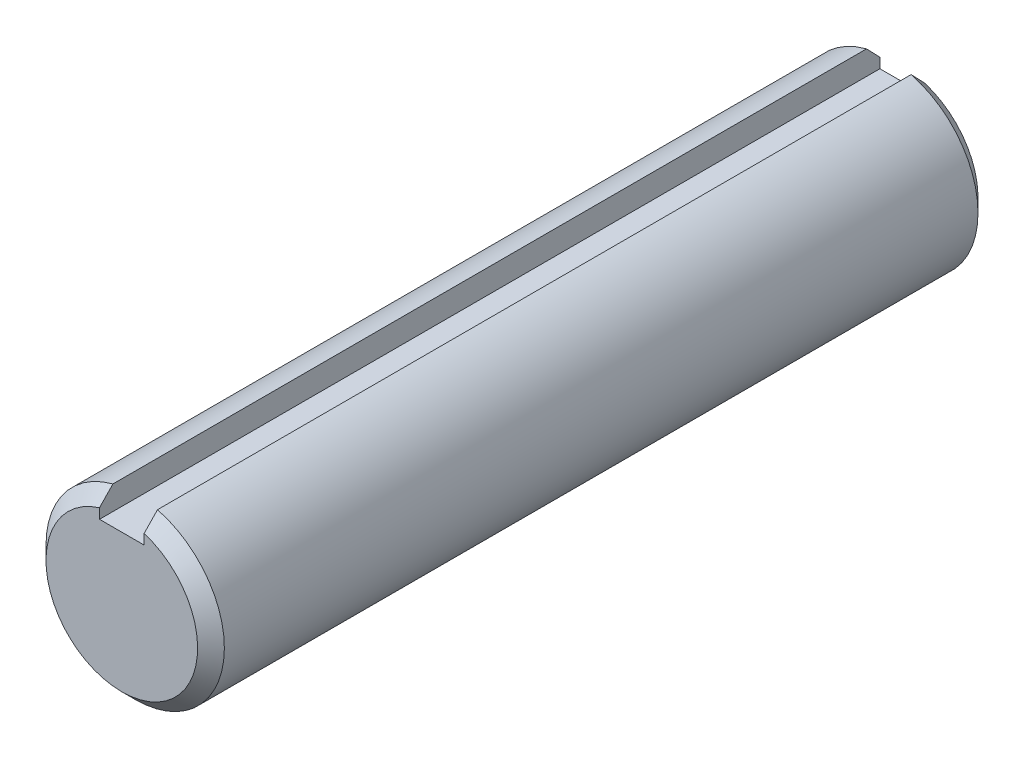
ISO-10303-21;
HEADER;
FILE_DESCRIPTION(('STEP AP214'),'2;1');
FILE_NAME('part.step','',(''),(''),'','','');
FILE_SCHEMA(('AUTOMOTIVE_DESIGN { 1 0 10303 214 1 1 1 1 }'));
ENDSEC;
DATA;
#1=APPLICATION_CONTEXT('core data for automotive mechanical design processes');
#2=APPLICATION_PROTOCOL_DEFINITION('international standard','automotive_design',2000,#1);
#3=PRODUCT_CONTEXT('',#1,'mechanical');
#4=PRODUCT('Part','Part','',(#3));
#5=PRODUCT_RELATED_PRODUCT_CATEGORY('part','',(#4));
#6=PRODUCT_DEFINITION_FORMATION('','',#4);
#7=PRODUCT_DEFINITION_CONTEXT('part definition',#1,'design');
#8=PRODUCT_DEFINITION('design','',#6,#7);
#9=PRODUCT_DEFINITION_SHAPE('','',#8);
#10=(LENGTH_UNIT() NAMED_UNIT(*) SI_UNIT(.MILLI.,.METRE.));
#11=(NAMED_UNIT(*) PLANE_ANGLE_UNIT() SI_UNIT($,.RADIAN.));
#12=(NAMED_UNIT(*) SI_UNIT($,.STERADIAN.) SOLID_ANGLE_UNIT());
#13=UNCERTAINTY_MEASURE_WITH_UNIT(LENGTH_MEASURE(1.E-05),#10,'distance_accuracy_value','');
#14=(GEOMETRIC_REPRESENTATION_CONTEXT(3) GLOBAL_UNCERTAINTY_ASSIGNED_CONTEXT((#13)) GLOBAL_UNIT_ASSIGNED_CONTEXT((#10,
#11,#12)) REPRESENTATION_CONTEXT('',''));
#15=CARTESIAN_POINT('',(0.,0.,0.));
#16=DIRECTION('',(0.,0.,1.));
#17=DIRECTION('',(1.,0.,0.));
#18=AXIS2_PLACEMENT_3D('',#15,#16,#17);
#19=CARTESIAN_POINT('',(0.,0.,17.5));
#20=DIRECTION('',(0.,0.,-1.));
#21=DIRECTION('',(-1.,0.,0.));
#22=AXIS2_PLACEMENT_3D('',#19,#20,#21);
#23=CYLINDRICAL_SURFACE('',#22,4.);
#24=CARTESIAN_POINT('',(0.,0.,16.9));
#25=DIRECTION('',(0.,0.,1.));
#26=DIRECTION('',(1.,0.,0.));
#27=AXIS2_PLACEMENT_3D('',#24,#25,#26);
#28=CIRCLE('',#27,4.);
#29=CARTESIAN_POINT('',(1.,3.87298334620742,16.9));
#30=VERTEX_POINT('',#29);
#31=CARTESIAN_POINT('',(-1.,3.87298334620742,16.9));
#32=VERTEX_POINT('',#31);
#33=EDGE_CURVE('E152',#30,#32,#28,.F.);
#34=ORIENTED_EDGE('',*,*,#33,.T.);
#35=DIRECTION('',(0.,0.,-1.));
#36=VECTOR('',#35,1.);
#37=CARTESIAN_POINT('',(-1.,3.87298334620742,17.5));
#38=LINE('',#37,#36);
#39=CARTESIAN_POINT('',(-1.,3.87298334620742,-16.9));
#40=VERTEX_POINT('',#39);
#41=EDGE_CURVE('E129',#32,#40,#38,.T.);
#42=ORIENTED_EDGE('',*,*,#41,.T.);
#43=CARTESIAN_POINT('',(0.,0.,-16.9));
#44=DIRECTION('',(0.,0.,1.));
#45=DIRECTION('',(1.,0.,0.));
#46=AXIS2_PLACEMENT_3D('',#43,#44,#45);
#47=CIRCLE('',#46,4.);
#48=CARTESIAN_POINT('',(1.,3.87298334620742,-16.9));
#49=VERTEX_POINT('',#48);
#50=EDGE_CURVE('E149',#40,#49,#47,.T.);
#51=ORIENTED_EDGE('',*,*,#50,.T.);
#52=DIRECTION('',(0.,0.,-1.));
#53=VECTOR('',#52,1.);
#54=CARTESIAN_POINT('',(1.,3.87298334620742,17.5));
#55=LINE('',#54,#53);
#56=EDGE_CURVE('E118',#49,#30,#55,.F.);
#57=ORIENTED_EDGE('',*,*,#56,.T.);
#58=EDGE_LOOP('',(#34,#42,#51,#57));
#59=FACE_BOUND('',#58,.T.);
#60=ADVANCED_FACE('F32',(#59),#23,.T.);
#61=CARTESIAN_POINT('',(0.,0.,17.5));
#62=DIRECTION('',(0.,0.,1.));
#63=DIRECTION('',(1.,0.,0.));
#64=AXIS2_PLACEMENT_3D('',#61,#62,#63);
#65=PLANE('',#64);
#66=DIRECTION('',(0.,-1.,0.));
#67=VECTOR('',#66,1.);
#68=CARTESIAN_POINT('',(-1.,4.,17.5));
#69=LINE('',#68,#67);
#70=CARTESIAN_POINT('',(-1.,3.24961536185438,17.5));
#71=VERTEX_POINT('',#70);
#72=CARTESIAN_POINT('',(-1.,2.8,17.5));
#73=VERTEX_POINT('',#72);
#74=EDGE_CURVE('E88',#71,#73,#69,.T.);
#75=ORIENTED_EDGE('',*,*,#74,.F.);
#76=CARTESIAN_POINT('',(0.,0.,17.5));
#77=DIRECTION('',(0.,0.,1.));
#78=DIRECTION('',(1.,0.,0.));
#79=AXIS2_PLACEMENT_3D('',#76,#77,#78);
#80=CIRCLE('',#79,3.4);
#81=CARTESIAN_POINT('',(1.,3.24961536185438,17.5));
#82=VERTEX_POINT('',#81);
#83=EDGE_CURVE('E144',#71,#82,#80,.T.);
#84=ORIENTED_EDGE('',*,*,#83,.T.);
#85=DIRECTION('',(0.,1.,0.));
#86=VECTOR('',#85,1.);
#87=CARTESIAN_POINT('',(1.,4.,17.5));
#88=LINE('',#87,#86);
#89=CARTESIAN_POINT('',(1.,2.8,17.5));
#90=VERTEX_POINT('',#89);
#91=EDGE_CURVE('E53',#90,#82,#88,.T.);
#92=ORIENTED_EDGE('',*,*,#91,.F.);
#93=DIRECTION('',(1.,0.,0.));
#94=VECTOR('',#93,1.);
#95=CARTESIAN_POINT('',(-1.,2.8,17.5));
#96=LINE('',#95,#94);
#97=EDGE_CURVE('E98',#73,#90,#96,.T.);
#98=ORIENTED_EDGE('',*,*,#97,.F.);
#99=EDGE_LOOP('',(#75,#84,#92,#98));
#100=FACE_BOUND('',#99,.T.);
#101=ADVANCED_FACE('F109',(#100),#65,.T.);
#102=CARTESIAN_POINT('',(0.,0.,-17.5));
#103=DIRECTION('',(0.,0.,1.));
#104=DIRECTION('',(1.,0.,0.));
#105=AXIS2_PLACEMENT_3D('',#102,#103,#104);
#106=PLANE('',#105);
#107=CARTESIAN_POINT('',(0.,0.,-17.5));
#108=DIRECTION('',(0.,0.,1.));
#109=DIRECTION('',(1.,0.,0.));
#110=AXIS2_PLACEMENT_3D('',#107,#108,#109);
#111=CIRCLE('',#110,3.39999999999999);
#112=CARTESIAN_POINT('',(1.,3.24961536185437,-17.5));
#113=VERTEX_POINT('',#112);
#114=CARTESIAN_POINT('',(-1.,3.24961536185437,-17.5));
#115=VERTEX_POINT('',#114);
#116=EDGE_CURVE('E146',#113,#115,#111,.F.);
#117=ORIENTED_EDGE('',*,*,#116,.T.);
#118=DIRECTION('',(0.,-1.,0.));
#119=VECTOR('',#118,1.);
#120=CARTESIAN_POINT('',(-1.,4.,-17.5));
#121=LINE('',#120,#119);
#122=CARTESIAN_POINT('',(-1.,2.8,-17.5));
#123=VERTEX_POINT('',#122);
#124=EDGE_CURVE('E111',#115,#123,#121,.T.);
#125=ORIENTED_EDGE('',*,*,#124,.T.);
#126=DIRECTION('',(1.,0.,0.));
#127=VECTOR('',#126,1.);
#128=CARTESIAN_POINT('',(-1.,2.8,-17.5));
#129=LINE('',#128,#127);
#130=CARTESIAN_POINT('',(1.,2.8,-17.5));
#131=VERTEX_POINT('',#130);
#132=EDGE_CURVE('E104',#123,#131,#129,.T.);
#133=ORIENTED_EDGE('',*,*,#132,.T.);
#134=DIRECTION('',(0.,1.,0.));
#135=VECTOR('',#134,1.);
#136=CARTESIAN_POINT('',(1.,4.,-17.5));
#137=LINE('',#136,#135);
#138=EDGE_CURVE('E107',#131,#113,#137,.T.);
#139=ORIENTED_EDGE('',*,*,#138,.T.);
#140=EDGE_LOOP('',(#117,#125,#133,#139));
#141=FACE_BOUND('',#140,.T.);
#142=ADVANCED_FACE('F164',(#141),#106,.F.);
#143=CARTESIAN_POINT('',(0.,0.,-16.9));
#144=DIRECTION('',(0.,0.,1.));
#145=DIRECTION('',(1.,0.,0.));
#146=AXIS2_PLACEMENT_3D('',#143,#144,#145);
#147=CONICAL_SURFACE('',#146,4.,0.785398163397448);
#148=CARTESIAN_POINT('',(-1.,1.35081586044512,-19.2193145776707));
#149=CARTESIAN_POINT('',(-1.,1.41488066306063,-19.1677819180893));
#150=CARTESIAN_POINT('',(-1.,1.47834718315388,-19.1155190121442));
#151=CARTESIAN_POINT('',(-1.,1.60431909726052,-19.0098610895691));
#152=CARTESIAN_POINT('',(-1.,1.66682460819919,-18.9564662125761));
#153=CARTESIAN_POINT('',(-1.,1.79110830645551,-18.8488748489054));
#154=CARTESIAN_POINT('',(-1.,1.85288669062793,-18.7946785885892));
#155=CARTESIAN_POINT('',(-1.,1.97588779267709,-18.6856554471097));
#156=CARTESIAN_POINT('',(-1.,2.03711049082799,-18.6308285437153));
#157=CARTESIAN_POINT('',(-1.,2.22007183752193,-18.4656732576281));
#158=CARTESIAN_POINT('',(-1.,2.34115805740112,-18.3546228023411));
#159=CARTESIAN_POINT('',(-1.,2.58220273418877,-18.1312938836685));
#160=CARTESIAN_POINT('',(-1.,2.70216111581648,-18.0190153393776));
#161=CARTESIAN_POINT('',(-1.,2.90589091931234,-17.8269857063987));
#162=CARTESIAN_POINT('',(-1.,2.98986154396475,-17.7474457040524));
#163=CARTESIAN_POINT('',(-1.,3.15749767385886,-17.5880337926722));
#164=CARTESIAN_POINT('',(-1.,3.24116315833901,-17.5081618618169));
#165=CARTESIAN_POINT('',(-1.,3.48509842555487,-17.2745671002813));
#166=CARTESIAN_POINT('',(-1.,3.64503682524598,-17.1204983050087));
#167=CARTESIAN_POINT('',(-1.,3.96429640051124,-16.811722329736));
#168=CARTESIAN_POINT('',(-1.,4.1236175738643,-16.6570151474428));
#169=CARTESIAN_POINT('',(-1.,4.44177985420495,-16.3471885210976));
#170=CARTESIAN_POINT('',(-1.,4.60062107239222,-16.1920691911779));
#171=CARTESIAN_POINT('',(-1.,4.91797030091099,-15.8814935510322));
#172=CARTESIAN_POINT('',(-1.,5.07647831497418,-15.7260372446202));
#173=CARTESIAN_POINT('',(-1.,5.23487471717617,-15.5704678156023));
#174=B_SPLINE_CURVE_WITH_KNOTS('',3,(#148,#149,#150,#151,#152,#153,#154,#155,#156,#157,#158,
#159,#160,#161,#162,#163,#164,#165,#166,#167,#168,#169,#170,#171,#172,#173),.UNSPECIFIED.,.F.,
.F.,(4,2,2,2,2,2,2,2,2,2,2,2,4),(0.,0.246638527108011,0.493246804550317,0.73978670666486,
0.98633532653122,1.47921612753496,1.97212959697097,2.31911430749398,2.66612220192963,
3.332345371537,3.99857093633251,4.6646280446703,5.33067765339345),.UNSPECIFIED.);
#175=EDGE_CURVE('E61',#115,#40,#174,.T.);
#176=ORIENTED_EDGE('',*,*,#175,.F.);
#177=ORIENTED_EDGE('',*,*,#116,.F.);
#178=CARTESIAN_POINT('',(1.,5.23487471717617,-15.5704678156023));
#179=CARTESIAN_POINT('',(1.,5.07642976511734,-15.7260850635911));
#180=CARTESIAN_POINT('',(1.,4.91787303822036,-15.8815890063281));
#181=CARTESIAN_POINT('',(1.,4.60043442524243,-16.1922515783813));
#182=CARTESIAN_POINT('',(1.,4.44155255272162,-16.3474102215566));
#183=CARTESIAN_POINT('',(1.,4.12339792056105,-16.6572286939957));
#184=CARTESIAN_POINT('',(1.,3.96412529582628,-16.8118886617124));
#185=CARTESIAN_POINT('',(1.,3.64495454195615,-17.1205770374935));
#186=CARTESIAN_POINT('',(1.,3.48505638500136,-17.2746054168307));
#187=CARTESIAN_POINT('',(1.,3.16427810361861,-17.5817896736052));
#188=CARTESIAN_POINT('',(1.,3.00339754942277,-17.7349451025749));
#189=CARTESIAN_POINT('',(1.,2.68026393133356,-18.0397741705045));
#190=CARTESIAN_POINT('',(1.,2.51801101305171,-18.1914479630795));
#191=CARTESIAN_POINT('',(1.,2.27284509960379,-18.4170936253633));
#192=CARTESIAN_POINT('',(1.,2.19080682391783,-18.4920145563211));
#193=CARTESIAN_POINT('',(1.,2.02594222380101,-18.6409764949062));
#194=CARTESIAN_POINT('',(1.,1.94311594332784,-18.7150175511038));
#195=CARTESIAN_POINT('',(1.,1.77634824406914,-18.8619013656389));
#196=CARTESIAN_POINT('',(1.,1.69240642828068,-18.9347436755316));
#197=CARTESIAN_POINT('',(1.,1.56532637426185,-19.0426501770363));
#198=CARTESIAN_POINT('',(1.,1.52276776255762,-19.0783961330172));
#199=CARTESIAN_POINT('',(1.,1.43717223649483,-19.1493154130559));
#200=CARTESIAN_POINT('',(1.,1.39413529386853,-19.1844887029652));
#201=CARTESIAN_POINT('',(1.,1.35081586044512,-19.2193145776707));
#202=B_SPLINE_CURVE_WITH_KNOTS('',3,(#178,#179,#180,#181,#182,#183,#184,#185,#186,#187,#188,
#189,#190,#191,#192,#193,#194,#195,#196,#197,#198,#199,#200,#201),.UNSPECIFIED.,.F.,.F.,(4,2,2,
2,2,2,2,2,2,2,2,4),(0.,0.66625401987663,1.33248079806412,1.9985031425817,2.66455545185874,
3.33092366291565,3.99722203595525,4.33052034592894,4.66380017110566,4.99720196323079,
5.16393407836719,5.3306760997552),.UNSPECIFIED.);
#203=EDGE_CURVE('E122',#49,#113,#202,.T.);
#204=ORIENTED_EDGE('',*,*,#203,.F.);
#205=ORIENTED_EDGE('',*,*,#50,.F.);
#206=EDGE_LOOP('',(#176,#177,#204,#205));
#207=FACE_BOUND('',#206,.T.);
#208=ADVANCED_FACE('F131',(#207),#147,.T.);
#209=CARTESIAN_POINT('',(0.,0.,17.5));
#210=DIRECTION('',(0.,0.,-1.));
#211=DIRECTION('',(-1.,0.,0.));
#212=AXIS2_PLACEMENT_3D('',#209,#210,#211);
#213=CONICAL_SURFACE('',#212,3.4,0.785398163397448);
#214=CARTESIAN_POINT('',(-1.,5.23487471717617,15.5704678156024));
#215=CARTESIAN_POINT('',(-1.,5.07642976511733,15.7260850635911));
#216=CARTESIAN_POINT('',(-1.,4.91787303822035,15.8815890063281));
#217=CARTESIAN_POINT('',(-1.,4.60043442524243,16.1922515783813));
#218=CARTESIAN_POINT('',(-1.,4.44155255272162,16.3474102215566));
#219=CARTESIAN_POINT('',(-1.,4.12339792056104,16.6572286939957));
#220=CARTESIAN_POINT('',(-1.,3.96412529582627,16.8118886617124));
#221=CARTESIAN_POINT('',(-1.,3.64495454195615,17.1205770374935));
#222=CARTESIAN_POINT('',(-1.,3.48505638500136,17.2746054168307));
#223=CARTESIAN_POINT('',(-1.,3.16427810361861,17.5817896736052));
#224=CARTESIAN_POINT('',(-1.,3.00339754942277,17.7349451025749));
#225=CARTESIAN_POINT('',(-1.,2.68026393133356,18.0397741705045));
#226=CARTESIAN_POINT('',(-1.,2.51801101305172,18.1914479630795));
#227=CARTESIAN_POINT('',(-1.,2.27284509960379,18.4170936253633));
#228=CARTESIAN_POINT('',(-1.,2.19080682391783,18.4920145563211));
#229=CARTESIAN_POINT('',(-1.,2.02594222380101,18.6409764949062));
#230=CARTESIAN_POINT('',(-1.,1.94311594332784,18.7150175511038));
#231=CARTESIAN_POINT('',(-1.,1.77634824406914,18.8619013656389));
#232=CARTESIAN_POINT('',(-1.,1.69240642828068,18.9347436755316));
#233=CARTESIAN_POINT('',(-1.,1.56532637426186,19.0426501770363));
#234=CARTESIAN_POINT('',(-1.,1.52276776255763,19.0783961330172));
#235=CARTESIAN_POINT('',(-1.,1.43717223649483,19.1493154130559));
#236=CARTESIAN_POINT('',(-1.,1.39413529386854,19.1844887029652));
#237=CARTESIAN_POINT('',(-1.,1.35081586044513,19.2193145776707));
#238=B_SPLINE_CURVE_WITH_KNOTS('',3,(#214,#215,#216,#217,#218,#219,#220,#221,#222,#223,#224,
#225,#226,#227,#228,#229,#230,#231,#232,#233,#234,#235,#236,#237),.UNSPECIFIED.,.F.,.F.,(4,2,2,
2,2,2,2,2,2,2,2,4),(0.,0.666254019876632,1.33248079806412,1.9985031425817,2.66455545185874,
3.33092366291565,3.99722203595525,4.33052034592893,4.66380017110566,4.99720196323078,
5.16393407836718,5.33067609975519),.UNSPECIFIED.);
#239=EDGE_CURVE('E11',#32,#71,#238,.T.);
#240=ORIENTED_EDGE('',*,*,#239,.F.);
#241=ORIENTED_EDGE('',*,*,#33,.F.);
#242=CARTESIAN_POINT('',(1.,1.35081586044513,19.2193145776707));
#243=CARTESIAN_POINT('',(1.,1.41488066306063,19.1677819180893));
#244=CARTESIAN_POINT('',(1.,1.47834718315389,19.1155190121442));
#245=CARTESIAN_POINT('',(1.,1.60431909726053,19.0098610895691));
#246=CARTESIAN_POINT('',(1.,1.66682460819919,18.9564662125761));
#247=CARTESIAN_POINT('',(1.,1.79110830645551,18.8488748489054));
#248=CARTESIAN_POINT('',(1.,1.85288669062794,18.7946785885892));
#249=CARTESIAN_POINT('',(1.,1.97588779267709,18.6856554471097));
#250=CARTESIAN_POINT('',(1.,2.03711049082799,18.6308285437153));
#251=CARTESIAN_POINT('',(1.,2.22007183752194,18.4656732576281));
#252=CARTESIAN_POINT('',(1.,2.34115805740112,18.3546228023411));
#253=CARTESIAN_POINT('',(1.,2.58220273418877,18.1312938836685));
#254=CARTESIAN_POINT('',(1.,2.70216111581649,18.0190153393776));
#255=CARTESIAN_POINT('',(1.,2.90589091931234,17.8269857063987));
#256=CARTESIAN_POINT('',(1.,2.98986154396476,17.7474457040524));
#257=CARTESIAN_POINT('',(1.,3.15749767385886,17.5880337926722));
#258=CARTESIAN_POINT('',(1.,3.24116315833901,17.5081618618169));
#259=CARTESIAN_POINT('',(1.,3.48509842555487,17.2745671002813));
#260=CARTESIAN_POINT('',(1.,3.64503682524598,17.1204983050087));
#261=CARTESIAN_POINT('',(1.,3.96429640051124,16.811722329736));
#262=CARTESIAN_POINT('',(1.,4.1236175738643,16.6570151474428));
#263=CARTESIAN_POINT('',(1.,4.44177985420495,16.3471885210976));
#264=CARTESIAN_POINT('',(1.,4.60062107239221,16.1920691911779));
#265=CARTESIAN_POINT('',(1.,4.91797030091098,15.8814935510322));
#266=CARTESIAN_POINT('',(1.,5.07647831497417,15.7260372446202));
#267=CARTESIAN_POINT('',(1.,5.23487471717617,15.5704678156024));
#268=B_SPLINE_CURVE_WITH_KNOTS('',3,(#242,#243,#244,#245,#246,#247,#248,#249,#250,#251,#252,
#253,#254,#255,#256,#257,#258,#259,#260,#261,#262,#263,#264,#265,#266,#267),.UNSPECIFIED.,.F.,
.F.,(4,2,2,2,2,2,2,2,2,2,2,2,4),(0.,0.246638527108011,0.493246804550317,0.739786706664863,
0.986335326531219,1.47921612753496,1.97212959697097,2.31911430749398,2.66612220192962,
3.33234537153699,3.9985709363325,4.66462804467029,5.33067765339344),.UNSPECIFIED.);
#269=EDGE_CURVE('E46',#82,#30,#268,.T.);
#270=ORIENTED_EDGE('',*,*,#269,.F.);
#271=ORIENTED_EDGE('',*,*,#83,.F.);
#272=EDGE_LOOP('',(#240,#241,#270,#271));
#273=FACE_BOUND('',#272,.T.);
#274=ADVANCED_FACE('F34',(#273),#213,.T.);
#275=CARTESIAN_POINT('',(-1.,4.,-17.5));
#276=DIRECTION('',(-1.,0.,0.));
#277=DIRECTION('',(0.,-1.,0.));
#278=AXIS2_PLACEMENT_3D('',#275,#276,#277);
#279=PLANE('',#278);
#280=ORIENTED_EDGE('',*,*,#175,.T.);
#281=ORIENTED_EDGE('',*,*,#41,.F.);
#282=ORIENTED_EDGE('',*,*,#239,.T.);
#283=ORIENTED_EDGE('',*,*,#74,.T.);
#284=DIRECTION('',(0.,0.,1.));
#285=VECTOR('',#284,1.);
#286=CARTESIAN_POINT('',(-1.,2.8,-17.5));
#287=LINE('',#286,#285);
#288=EDGE_CURVE('E91',#123,#73,#287,.T.);
#289=ORIENTED_EDGE('',*,*,#288,.F.);
#290=ORIENTED_EDGE('',*,*,#124,.F.);
#291=EDGE_LOOP('',(#280,#281,#282,#283,#289,#290));
#292=FACE_BOUND('',#291,.T.);
#293=ADVANCED_FACE('F90',(#292),#279,.F.);
#294=CARTESIAN_POINT('',(1.,4.,-17.5));
#295=DIRECTION('',(1.,0.,0.));
#296=DIRECTION('',(0.,1.,0.));
#297=AXIS2_PLACEMENT_3D('',#294,#295,#296);
#298=PLANE('',#297);
#299=ORIENTED_EDGE('',*,*,#203,.T.);
#300=ORIENTED_EDGE('',*,*,#138,.F.);
#301=DIRECTION('',(0.,0.,1.));
#302=VECTOR('',#301,1.);
#303=CARTESIAN_POINT('',(1.,2.8,-17.5));
#304=LINE('',#303,#302);
#305=EDGE_CURVE('E106',#131,#90,#304,.T.);
#306=ORIENTED_EDGE('',*,*,#305,.T.);
#307=ORIENTED_EDGE('',*,*,#91,.T.);
#308=ORIENTED_EDGE('',*,*,#269,.T.);
#309=ORIENTED_EDGE('',*,*,#56,.F.);
#310=EDGE_LOOP('',(#299,#300,#306,#307,#308,#309));
#311=FACE_BOUND('',#310,.T.);
#312=ADVANCED_FACE('F134',(#311),#298,.F.);
#313=CARTESIAN_POINT('',(-1.,2.8,-17.5));
#314=DIRECTION('',(0.,-1.,0.));
#315=DIRECTION('',(0.,0.,-1.));
#316=AXIS2_PLACEMENT_3D('',#313,#314,#315);
#317=PLANE('',#316);
#318=ORIENTED_EDGE('',*,*,#305,.F.);
#319=ORIENTED_EDGE('',*,*,#132,.F.);
#320=ORIENTED_EDGE('',*,*,#288,.T.);
#321=ORIENTED_EDGE('',*,*,#97,.T.);
#322=EDGE_LOOP('',(#318,#319,#320,#321));
#323=FACE_BOUND('',#322,.T.);
#324=ADVANCED_FACE('F102',(#323),#317,.F.);
#325=CLOSED_SHELL('',(#60,#101,#142,#208,#274,#293,#312,#324));
#326=MANIFOLD_SOLID_BREP('B2',#325);
#327=ADVANCED_BREP_SHAPE_REPRESENTATION('',(#18,#326),#14);
#328=SHAPE_DEFINITION_REPRESENTATION(#9,#327);
ENDSEC;
END-ISO-10303-21;
